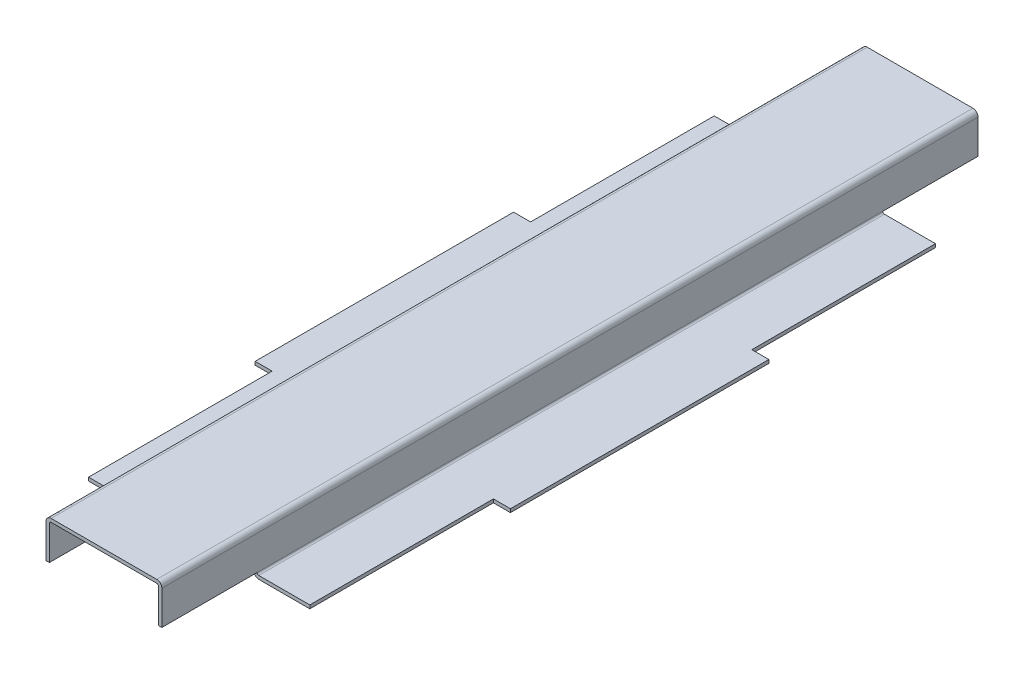
ISO-10303-21;
HEADER;
FILE_DESCRIPTION(('STEP AP214'),'2;1');
FILE_NAME('part.step','',(''),(''),'','','');
FILE_SCHEMA(('AUTOMOTIVE_DESIGN { 1 0 10303 214 1 1 1 1 }'));
ENDSEC;
DATA;
#1=APPLICATION_CONTEXT('core data for automotive mechanical design processes');
#2=APPLICATION_PROTOCOL_DEFINITION('international standard','automotive_design',2000,#1);
#3=PRODUCT_CONTEXT('',#1,'mechanical');
#4=PRODUCT('Part','Part','',(#3));
#5=PRODUCT_RELATED_PRODUCT_CATEGORY('part','',(#4));
#6=PRODUCT_DEFINITION_FORMATION('','',#4);
#7=PRODUCT_DEFINITION_CONTEXT('part definition',#1,'design');
#8=PRODUCT_DEFINITION('design','',#6,#7);
#9=PRODUCT_DEFINITION_SHAPE('','',#8);
#10=(LENGTH_UNIT() NAMED_UNIT(*) SI_UNIT(.MILLI.,.METRE.));
#11=(NAMED_UNIT(*) PLANE_ANGLE_UNIT() SI_UNIT($,.RADIAN.));
#12=(NAMED_UNIT(*) SI_UNIT($,.STERADIAN.) SOLID_ANGLE_UNIT());
#13=UNCERTAINTY_MEASURE_WITH_UNIT(LENGTH_MEASURE(1.E-05),#10,'distance_accuracy_value','');
#14=(GEOMETRIC_REPRESENTATION_CONTEXT(3) GLOBAL_UNCERTAINTY_ASSIGNED_CONTEXT((#13)) GLOBAL_UNIT_ASSIGNED_CONTEXT((#10,
#11,#12)) REPRESENTATION_CONTEXT('',''));
#15=CARTESIAN_POINT('',(0.,0.,0.));
#16=DIRECTION('',(0.,0.,1.));
#17=DIRECTION('',(1.,0.,0.));
#18=AXIS2_PLACEMENT_3D('',#15,#16,#17);
#19=CARTESIAN_POINT('',(-206.6,-79.375,584.2));
#20=DIRECTION('',(-1.,0.,0.));
#21=DIRECTION('',(0.,0.,1.));
#22=AXIS2_PLACEMENT_3D('',#19,#20,#21);
#23=PLANE('',#22);
#24=DIRECTION('',(0.,0.,-1.));
#25=VECTOR('',#24,1.);
#26=CARTESIAN_POINT('',(-206.6,-73.025,584.2));
#27=LINE('',#26,#25);
#28=CARTESIAN_POINT('',(-206.6,-73.025,584.2));
#29=VERTEX_POINT('',#28);
#30=CARTESIAN_POINT('',(-206.6,-73.025,241.3));
#31=VERTEX_POINT('',#30);
#32=EDGE_CURVE('E571',#29,#31,#27,.T.);
#33=ORIENTED_EDGE('',*,*,#32,.T.);
#34=DIRECTION('',(0.,-1.,0.));
#35=VECTOR('',#34,1.);
#36=CARTESIAN_POINT('',(-206.6,-79.375,241.3));
#37=LINE('',#36,#35);
#38=CARTESIAN_POINT('',(-206.6,-79.375,241.3));
#39=VERTEX_POINT('',#38);
#40=EDGE_CURVE('E252',#31,#39,#37,.T.);
#41=ORIENTED_EDGE('',*,*,#40,.T.);
#42=DIRECTION('',(0.,0.,-1.));
#43=VECTOR('',#42,1.);
#44=CARTESIAN_POINT('',(-206.6,-79.375,584.2));
#45=LINE('',#44,#43);
#46=CARTESIAN_POINT('',(-206.6,-79.375,584.2));
#47=VERTEX_POINT('',#46);
#48=EDGE_CURVE('E566',#47,#39,#45,.T.);
#49=ORIENTED_EDGE('',*,*,#48,.F.);
#50=DIRECTION('',(0.,1.,0.));
#51=VECTOR('',#50,1.);
#52=CARTESIAN_POINT('',(-206.6,-79.375,584.2));
#53=LINE('',#52,#51);
#54=EDGE_CURVE('E488',#47,#29,#53,.T.);
#55=ORIENTED_EDGE('',*,*,#54,.T.);
#56=EDGE_LOOP('',(#33,#41,#49,#55));
#57=FACE_BOUND('',#56,.T.);
#58=ADVANCED_FACE('F36',(#57),#23,.T.);
#59=CARTESIAN_POINT('',(-206.6,-79.3749999999999,-241.3));
#60=VERTEX_POINT('',#59);
#61=CARTESIAN_POINT('',(-206.6,-79.375,-584.2));
#62=VERTEX_POINT('',#61);
#63=EDGE_CURVE('E565',#60,#62,#45,.T.);
#64=ORIENTED_EDGE('',*,*,#63,.F.);
#65=DIRECTION('',(0.,1.,0.));
#66=VECTOR('',#65,1.);
#67=CARTESIAN_POINT('',(-206.6,-79.3749999999999,-241.3));
#68=LINE('',#67,#66);
#69=CARTESIAN_POINT('',(-206.6,-73.025,-241.3));
#70=VERTEX_POINT('',#69);
#71=EDGE_CURVE('E267',#60,#70,#68,.T.);
#72=ORIENTED_EDGE('',*,*,#71,.T.);
#73=CARTESIAN_POINT('',(-206.6,-73.025,-584.2));
#74=VERTEX_POINT('',#73);
#75=EDGE_CURVE('E570',#70,#74,#27,.T.);
#76=ORIENTED_EDGE('',*,*,#75,.T.);
#77=DIRECTION('',(0.,1.,0.));
#78=VECTOR('',#77,1.);
#79=CARTESIAN_POINT('',(-206.6,-79.375,-584.2));
#80=LINE('',#79,#78);
#81=EDGE_CURVE('E525',#62,#74,#80,.T.);
#82=ORIENTED_EDGE('',*,*,#81,.F.);
#83=EDGE_LOOP('',(#64,#72,#76,#82));
#84=FACE_BOUND('',#83,.T.);
#85=ADVANCED_FACE('F684',(#84),#23,.T.);
#86=CARTESIAN_POINT('',(111.35,-69.85,-584.2));
#87=DIRECTION('',(0.,0.,1.));
#88=DIRECTION('',(1.,0.,0.));
#89=AXIS2_PLACEMENT_3D('',#86,#87,#88);
#90=PLANE('',#89);
#91=CARTESIAN_POINT('',(-111.35,-69.85,-584.2));
#92=DIRECTION('',(0.,0.,1.));
#93=DIRECTION('',(1.,0.,0.));
#94=AXIS2_PLACEMENT_3D('',#91,#92,#93);
#95=CIRCLE('',#94,3.17499999999999);
#96=CARTESIAN_POINT('',(-111.35,-73.025,-584.2));
#97=VERTEX_POINT('',#96);
#98=CARTESIAN_POINT('',(-108.175,-69.85,-584.2));
#99=VERTEX_POINT('',#98);
#100=EDGE_CURVE('E518',#97,#99,#95,.T.);
#101=ORIENTED_EDGE('',*,*,#100,.T.);
#102=DIRECTION('',(1.,0.,0.));
#103=VECTOR('',#102,1.);
#104=CARTESIAN_POINT('',(-108.175,-69.85,-584.2));
#105=LINE('',#104,#103);
#106=CARTESIAN_POINT('',(-101.825,-69.85,-584.2));
#107=VERTEX_POINT('',#106);
#108=EDGE_CURVE('E299',#99,#107,#105,.T.);
#109=ORIENTED_EDGE('',*,*,#108,.T.);
#110=CARTESIAN_POINT('',(-111.35,-69.85,-584.2));
#111=DIRECTION('',(0.,0.,1.));
#112=DIRECTION('',(1.,0.,0.));
#113=AXIS2_PLACEMENT_3D('',#110,#111,#112);
#114=CIRCLE('',#113,9.525);
#115=CARTESIAN_POINT('',(-111.35,-79.375,-584.2));
#116=VERTEX_POINT('',#115);
#117=EDGE_CURVE('E532',#116,#107,#114,.T.);
#118=ORIENTED_EDGE('',*,*,#117,.F.);
#119=DIRECTION('',(1.,0.,0.));
#120=VECTOR('',#119,1.);
#121=CARTESIAN_POINT('',(-111.35,-79.375,-584.2));
#122=LINE('',#121,#120);
#123=EDGE_CURVE('E529',#62,#116,#122,.T.);
#124=ORIENTED_EDGE('',*,*,#123,.F.);
#125=ORIENTED_EDGE('',*,*,#81,.T.);
#126=DIRECTION('',(1.,0.,0.));
#127=VECTOR('',#126,1.);
#128=CARTESIAN_POINT('',(-111.35,-73.025,-584.2));
#129=LINE('',#128,#127);
#130=EDGE_CURVE('E521',#74,#97,#129,.T.);
#131=ORIENTED_EDGE('',*,*,#130,.T.);
#132=EDGE_LOOP('',(#101,#109,#118,#124,#125,#131));
#133=FACE_BOUND('',#132,.T.);
#134=ADVANCED_FACE('F690',(#133),#90,.F.);
#135=CARTESIAN_POINT('',(206.6,-73.025,584.2));
#136=DIRECTION('',(1.,0.,0.));
#137=DIRECTION('',(0.,0.,-1.));
#138=AXIS2_PLACEMENT_3D('',#135,#136,#137);
#139=PLANE('',#138);
#140=DIRECTION('',(0.,-1.,0.));
#141=VECTOR('',#140,1.);
#142=CARTESIAN_POINT('',(206.6,-79.375,241.3));
#143=LINE('',#142,#141);
#144=CARTESIAN_POINT('',(206.6,-73.025,241.3));
#145=VERTEX_POINT('',#144);
#146=CARTESIAN_POINT('',(206.6,-79.375,241.3));
#147=VERTEX_POINT('',#146);
#148=EDGE_CURVE('E361',#145,#147,#143,.T.);
#149=ORIENTED_EDGE('',*,*,#148,.F.);
#150=DIRECTION('',(0.,0.,-1.));
#151=VECTOR('',#150,1.);
#152=CARTESIAN_POINT('',(206.6,-73.025,584.2));
#153=LINE('',#152,#151);
#154=CARTESIAN_POINT('',(206.6,-73.025,584.2));
#155=VERTEX_POINT('',#154);
#156=EDGE_CURVE('E600',#155,#145,#153,.T.);
#157=ORIENTED_EDGE('',*,*,#156,.F.);
#158=DIRECTION('',(0.,-1.,0.));
#159=VECTOR('',#158,1.);
#160=CARTESIAN_POINT('',(206.6,-73.025,584.2));
#161=LINE('',#160,#159);
#162=CARTESIAN_POINT('',(206.6,-79.375,584.2));
#163=VERTEX_POINT('',#162);
#164=EDGE_CURVE('E467',#155,#163,#161,.T.);
#165=ORIENTED_EDGE('',*,*,#164,.T.);
#166=DIRECTION('',(0.,0.,-1.));
#167=VECTOR('',#166,1.);
#168=CARTESIAN_POINT('',(206.6,-79.375,584.2));
#169=LINE('',#168,#167);
#170=EDGE_CURVE('E11',#163,#147,#169,.T.);
#171=ORIENTED_EDGE('',*,*,#170,.T.);
#172=EDGE_LOOP('',(#149,#157,#165,#171));
#173=FACE_BOUND('',#172,.T.);
#174=ADVANCED_FACE('F629',(#173),#139,.T.);
#175=CARTESIAN_POINT('',(111.35,-69.85,584.2));
#176=DIRECTION('',(0.,0.,1.));
#177=DIRECTION('',(1.,0.,0.));
#178=AXIS2_PLACEMENT_3D('',#175,#176,#177);
#179=PLANE('',#178);
#180=DIRECTION('',(1.,0.,0.));
#181=VECTOR('',#180,1.);
#182=CARTESIAN_POINT('',(101.825,-69.85,584.2));
#183=LINE('',#182,#181);
#184=CARTESIAN_POINT('',(101.825,-69.85,584.2));
#185=VERTEX_POINT('',#184);
#186=CARTESIAN_POINT('',(108.175,-69.85,584.2));
#187=VERTEX_POINT('',#186);
#188=EDGE_CURVE('E401',#185,#187,#183,.T.);
#189=ORIENTED_EDGE('',*,*,#188,.F.);
#190=CARTESIAN_POINT('',(111.35,-69.85,584.2));
#191=DIRECTION('',(0.,0.,1.));
#192=DIRECTION('',(1.,0.,0.));
#193=AXIS2_PLACEMENT_3D('',#190,#191,#192);
#194=CIRCLE('',#193,9.525);
#195=CARTESIAN_POINT('',(111.35,-79.375,584.2));
#196=VERTEX_POINT('',#195);
#197=EDGE_CURVE('E499',#185,#196,#194,.T.);
#198=ORIENTED_EDGE('',*,*,#197,.T.);
#199=DIRECTION('',(1.,0.,0.));
#200=VECTOR('',#199,1.);
#201=CARTESIAN_POINT('',(111.35,-79.375,584.2));
#202=LINE('',#201,#200);
#203=EDGE_CURVE('E464',#196,#163,#202,.T.);
#204=ORIENTED_EDGE('',*,*,#203,.T.);
#205=ORIENTED_EDGE('',*,*,#164,.F.);
#206=DIRECTION('',(1.,0.,0.));
#207=VECTOR('',#206,1.);
#208=CARTESIAN_POINT('',(111.35,-73.025,584.2));
#209=LINE('',#208,#207);
#210=CARTESIAN_POINT('',(111.35,-73.025,584.2));
#211=VERTEX_POINT('',#210);
#212=EDGE_CURVE('E472',#211,#155,#209,.T.);
#213=ORIENTED_EDGE('',*,*,#212,.F.);
#214=CARTESIAN_POINT('',(111.35,-69.85,584.2));
#215=DIRECTION('',(0.,0.,1.));
#216=DIRECTION('',(1.,0.,0.));
#217=AXIS2_PLACEMENT_3D('',#214,#215,#216);
#218=CIRCLE('',#217,3.17499999999999);
#219=EDGE_CURVE('E476',#187,#211,#218,.T.);
#220=ORIENTED_EDGE('',*,*,#219,.F.);
#221=EDGE_LOOP('',(#189,#198,#204,#205,#213,#220));
#222=FACE_BOUND('',#221,.T.);
#223=ADVANCED_FACE('F625',(#222),#179,.T.);
#224=CARTESIAN_POINT('',(111.35,-79.375,584.2));
#225=DIRECTION('',(0.,1.,0.));
#226=DIRECTION('',(0.,0.,1.));
#227=AXIS2_PLACEMENT_3D('',#224,#225,#226);
#228=PLANE('',#227);
#229=DIRECTION('',(1.,0.,0.));
#230=VECTOR('',#229,1.);
#231=CARTESIAN_POINT('',(111.35,-79.375,-584.2));
#232=LINE('',#231,#230);
#233=CARTESIAN_POINT('',(111.35,-79.375,-584.2));
#234=VERTEX_POINT('',#233);
#235=CARTESIAN_POINT('',(206.6,-79.375,-584.2));
#236=VERTEX_POINT('',#235);
#237=EDGE_CURVE('E463',#234,#236,#232,.T.);
#238=ORIENTED_EDGE('',*,*,#237,.T.);
#239=CARTESIAN_POINT('',(206.6,-79.375,-241.3));
#240=VERTEX_POINT('',#239);
#241=EDGE_CURVE('E45',#240,#236,#169,.T.);
#242=ORIENTED_EDGE('',*,*,#241,.F.);
#243=DIRECTION('',(-1.,0.,0.));
#244=VECTOR('',#243,1.);
#245=CARTESIAN_POINT('',(238.35,-79.3749999999999,-241.3));
#246=LINE('',#245,#244);
#247=CARTESIAN_POINT('',(238.35,-79.3749999999999,-241.3));
#248=VERTEX_POINT('',#247);
#249=EDGE_CURVE('E387',#248,#240,#246,.T.);
#250=ORIENTED_EDGE('',*,*,#249,.F.);
#251=DIRECTION('',(0.,0.,-1.));
#252=VECTOR('',#251,1.);
#253=CARTESIAN_POINT('',(238.35,-79.375,241.3));
#254=LINE('',#253,#252);
#255=CARTESIAN_POINT('',(238.35,-79.375,241.3));
#256=VERTEX_POINT('',#255);
#257=EDGE_CURVE('E366',#256,#248,#254,.T.);
#258=ORIENTED_EDGE('',*,*,#257,.F.);
#259=DIRECTION('',(-1.,0.,0.));
#260=VECTOR('',#259,1.);
#261=CARTESIAN_POINT('',(238.35,-79.375,241.3));
#262=LINE('',#261,#260);
#263=EDGE_CURVE('E391',#256,#147,#262,.T.);
#264=ORIENTED_EDGE('',*,*,#263,.T.);
#265=ORIENTED_EDGE('',*,*,#170,.F.);
#266=ORIENTED_EDGE('',*,*,#203,.F.);
#267=DIRECTION('',(0.,0.,-1.));
#268=VECTOR('',#267,1.);
#269=CARTESIAN_POINT('',(111.35,-79.375,584.2));
#270=LINE('',#269,#268);
#271=EDGE_CURVE('E502',#196,#234,#270,.T.);
#272=ORIENTED_EDGE('',*,*,#271,.T.);
#273=EDGE_LOOP('',(#238,#242,#250,#258,#264,#265,#266,#272));
#274=FACE_BOUND('',#273,.T.);
#275=ADVANCED_FACE('F38',(#274),#228,.F.);
#276=DIRECTION('',(0.,1.,0.));
#277=VECTOR('',#276,1.);
#278=CARTESIAN_POINT('',(206.6,-79.3749999999999,-241.3));
#279=LINE('',#278,#277);
#280=CARTESIAN_POINT('',(206.6,-73.0249999999999,-241.3));
#281=VERTEX_POINT('',#280);
#282=EDGE_CURVE('E60',#240,#281,#279,.T.);
#283=ORIENTED_EDGE('',*,*,#282,.F.);
#284=ORIENTED_EDGE('',*,*,#241,.T.);
#285=DIRECTION('',(0.,-1.,0.));
#286=VECTOR('',#285,1.);
#287=CARTESIAN_POINT('',(206.6,-73.025,-584.2));
#288=LINE('',#287,#286);
#289=CARTESIAN_POINT('',(206.6,-73.025,-584.2));
#290=VERTEX_POINT('',#289);
#291=EDGE_CURVE('E506',#290,#236,#288,.T.);
#292=ORIENTED_EDGE('',*,*,#291,.F.);
#293=EDGE_CURVE('E599',#281,#290,#153,.T.);
#294=ORIENTED_EDGE('',*,*,#293,.F.);
#295=EDGE_LOOP('',(#283,#284,#292,#294));
#296=FACE_BOUND('',#295,.T.);
#297=ADVANCED_FACE('F612',(#296),#139,.T.);
#298=CARTESIAN_POINT('',(111.35,-73.025,584.2));
#299=DIRECTION('',(0.,1.,0.));
#300=DIRECTION('',(0.,0.,1.));
#301=AXIS2_PLACEMENT_3D('',#298,#299,#300);
#302=PLANE('',#301);
#303=DIRECTION('',(1.,0.,0.));
#304=VECTOR('',#303,1.);
#305=CARTESIAN_POINT('',(111.35,-73.025,-584.2));
#306=LINE('',#305,#304);
#307=CARTESIAN_POINT('',(111.35,-73.025,-584.2));
#308=VERTEX_POINT('',#307);
#309=EDGE_CURVE('E510',#308,#290,#306,.T.);
#310=ORIENTED_EDGE('',*,*,#309,.F.);
#311=DIRECTION('',(0.,0.,-1.));
#312=VECTOR('',#311,1.);
#313=CARTESIAN_POINT('',(111.35,-73.025,584.2));
#314=LINE('',#313,#312);
#315=EDGE_CURVE('E597',#211,#308,#314,.T.);
#316=ORIENTED_EDGE('',*,*,#315,.F.);
#317=ORIENTED_EDGE('',*,*,#212,.T.);
#318=ORIENTED_EDGE('',*,*,#156,.T.);
#319=DIRECTION('',(-1.,0.,0.));
#320=VECTOR('',#319,1.);
#321=CARTESIAN_POINT('',(238.35,-73.025,241.3));
#322=LINE('',#321,#320);
#323=CARTESIAN_POINT('',(238.35,-73.025,241.3));
#324=VERTEX_POINT('',#323);
#325=EDGE_CURVE('E374',#324,#145,#322,.T.);
#326=ORIENTED_EDGE('',*,*,#325,.F.);
#327=DIRECTION('',(0.,0.,1.));
#328=VECTOR('',#327,1.);
#329=CARTESIAN_POINT('',(238.35,-73.025,241.3));
#330=LINE('',#329,#328);
#331=CARTESIAN_POINT('',(238.35,-73.0249999999999,-241.3));
#332=VERTEX_POINT('',#331);
#333=EDGE_CURVE('E372',#332,#324,#330,.T.);
#334=ORIENTED_EDGE('',*,*,#333,.F.);
#335=DIRECTION('',(-1.,0.,0.));
#336=VECTOR('',#335,1.);
#337=CARTESIAN_POINT('',(238.35,-73.0249999999999,-241.3));
#338=LINE('',#337,#336);
#339=EDGE_CURVE('E383',#332,#281,#338,.T.);
#340=ORIENTED_EDGE('',*,*,#339,.T.);
#341=ORIENTED_EDGE('',*,*,#293,.T.);
#342=EDGE_LOOP('',(#310,#316,#317,#318,#326,#334,#340,#341));
#343=FACE_BOUND('',#342,.T.);
#344=ADVANCED_FACE('F609',(#343),#302,.T.);
#345=CARTESIAN_POINT('',(111.35,-69.85,584.2));
#346=DIRECTION('',(0.,0.,-1.));
#347=DIRECTION('',(-1.,0.,0.));
#348=AXIS2_PLACEMENT_3D('',#345,#346,#347);
#349=CYLINDRICAL_SURFACE('',#348,3.17499999999999);
#350=CARTESIAN_POINT('',(111.35,-69.85,-584.2));
#351=DIRECTION('',(0.,0.,1.));
#352=DIRECTION('',(1.,0.,0.));
#353=AXIS2_PLACEMENT_3D('',#350,#351,#352);
#354=CIRCLE('',#353,3.17499999999999);
#355=CARTESIAN_POINT('',(108.175,-69.85,-584.2));
#356=VERTEX_POINT('',#355);
#357=EDGE_CURVE('E514',#356,#308,#354,.T.);
#358=ORIENTED_EDGE('',*,*,#357,.F.);
#359=DIRECTION('',(0.,0.,-1.));
#360=VECTOR('',#359,1.);
#361=CARTESIAN_POINT('',(108.175,-69.85,584.2));
#362=LINE('',#361,#360);
#363=EDGE_CURVE('E593',#187,#356,#362,.T.);
#364=ORIENTED_EDGE('',*,*,#363,.F.);
#365=ORIENTED_EDGE('',*,*,#219,.T.);
#366=ORIENTED_EDGE('',*,*,#315,.T.);
#367=EDGE_LOOP('',(#358,#364,#365,#366));
#368=FACE_BOUND('',#367,.T.);
#369=ADVANCED_FACE('F620',(#368),#349,.F.);
#370=CARTESIAN_POINT('',(108.175,-6.35,584.2));
#371=DIRECTION('',(1.,0.,0.));
#372=DIRECTION('',(0.,1.,0.));
#373=AXIS2_PLACEMENT_3D('',#370,#371,#372);
#374=PLANE('',#373);
#375=ORIENTED_EDGE('',*,*,#363,.T.);
#376=DIRECTION('',(0.,0.,1.));
#377=VECTOR('',#376,1.);
#378=CARTESIAN_POINT('',(108.175,-69.85,-762.));
#379=LINE('',#378,#377);
#380=CARTESIAN_POINT('',(108.175,-69.85,-762.));
#381=VERTEX_POINT('',#380);
#382=EDGE_CURVE('E358',#381,#356,#379,.T.);
#383=ORIENTED_EDGE('',*,*,#382,.F.);
#384=DIRECTION('',(0.,1.,0.));
#385=VECTOR('',#384,1.);
#386=CARTESIAN_POINT('',(108.175,-69.85,-762.));
#387=LINE('',#386,#385);
#388=CARTESIAN_POINT('',(108.175,-6.35,-762.));
#389=VERTEX_POINT('',#388);
#390=EDGE_CURVE('E294',#381,#389,#387,.T.);
#391=ORIENTED_EDGE('',*,*,#390,.T.);
#392=DIRECTION('',(0.,0.,-1.));
#393=VECTOR('',#392,1.);
#394=CARTESIAN_POINT('',(108.175,-6.35,584.2));
#395=LINE('',#394,#393);
#396=CARTESIAN_POINT('',(108.175,-6.35,762.));
#397=VERTEX_POINT('',#396);
#398=EDGE_CURVE('E590',#397,#389,#395,.T.);
#399=ORIENTED_EDGE('',*,*,#398,.F.);
#400=DIRECTION('',(0.,1.,0.));
#401=VECTOR('',#400,1.);
#402=CARTESIAN_POINT('',(108.175,-69.85,762.));
#403=LINE('',#402,#401);
#404=CARTESIAN_POINT('',(108.175,-69.85,762.));
#405=VERTEX_POINT('',#404);
#406=EDGE_CURVE('E396',#405,#397,#403,.T.);
#407=ORIENTED_EDGE('',*,*,#406,.F.);
#408=DIRECTION('',(0.,0.,-1.));
#409=VECTOR('',#408,1.);
#410=CARTESIAN_POINT('',(108.175,-69.85,762.));
#411=LINE('',#410,#409);
#412=EDGE_CURVE('E441',#405,#187,#411,.T.);
#413=ORIENTED_EDGE('',*,*,#412,.T.);
#414=EDGE_LOOP('',(#375,#383,#391,#399,#407,#413));
#415=FACE_BOUND('',#414,.T.);
#416=ADVANCED_FACE('F657',(#415),#374,.T.);
#417=CARTESIAN_POINT('',(98.65,-6.35,584.2));
#418=DIRECTION('',(0.,0.,-1.));
#419=DIRECTION('',(-1.,0.,0.));
#420=AXIS2_PLACEMENT_3D('',#417,#418,#419);
#421=CYLINDRICAL_SURFACE('',#420,9.525);
#422=ORIENTED_EDGE('',*,*,#398,.T.);
#423=CARTESIAN_POINT('',(98.65,-6.35,-762.));
#424=DIRECTION('',(0.,0.,1.));
#425=DIRECTION('',(1.,0.,0.));
#426=AXIS2_PLACEMENT_3D('',#423,#424,#425);
#427=CIRCLE('',#426,9.52499999999999);
#428=CARTESIAN_POINT('',(98.65,3.175,-762.));
#429=VERTEX_POINT('',#428);
#430=EDGE_CURVE('E339',#389,#429,#427,.T.);
#431=ORIENTED_EDGE('',*,*,#430,.T.);
#432=DIRECTION('',(0.,0.,-1.));
#433=VECTOR('',#432,1.);
#434=CARTESIAN_POINT('',(98.65,3.175,584.2));
#435=LINE('',#434,#433);
#436=CARTESIAN_POINT('',(98.65,3.175,762.));
#437=VERTEX_POINT('',#436);
#438=EDGE_CURVE('E587',#437,#429,#435,.T.);
#439=ORIENTED_EDGE('',*,*,#438,.F.);
#440=CARTESIAN_POINT('',(98.65,-6.35,762.));
#441=DIRECTION('',(0.,0.,1.));
#442=DIRECTION('',(1.,0.,0.));
#443=AXIS2_PLACEMENT_3D('',#440,#441,#442);
#444=CIRCLE('',#443,9.52499999999999);
#445=EDGE_CURVE('E400',#397,#437,#444,.T.);
#446=ORIENTED_EDGE('',*,*,#445,.F.);
#447=EDGE_LOOP('',(#422,#431,#439,#446));
#448=FACE_BOUND('',#447,.T.);
#449=ADVANCED_FACE('F664',(#448),#421,.T.);
#450=CARTESIAN_POINT('',(-98.65,3.175,584.2));
#451=DIRECTION('',(0.,1.,0.));
#452=DIRECTION('',(0.,0.,1.));
#453=AXIS2_PLACEMENT_3D('',#450,#451,#452);
#454=PLANE('',#453);
#455=ORIENTED_EDGE('',*,*,#438,.T.);
#456=DIRECTION('',(-1.,0.,0.));
#457=VECTOR('',#456,1.);
#458=CARTESIAN_POINT('',(98.65,3.175,-762.));
#459=LINE('',#458,#457);
#460=CARTESIAN_POINT('',(-98.65,3.175,-762.));
#461=VERTEX_POINT('',#460);
#462=EDGE_CURVE('E335',#429,#461,#459,.T.);
#463=ORIENTED_EDGE('',*,*,#462,.T.);
#464=DIRECTION('',(0.,0.,-1.));
#465=VECTOR('',#464,1.);
#466=CARTESIAN_POINT('',(-98.65,3.175,584.2));
#467=LINE('',#466,#465);
#468=CARTESIAN_POINT('',(-98.65,3.175,762.));
#469=VERTEX_POINT('',#468);
#470=EDGE_CURVE('E584',#469,#461,#467,.T.);
#471=ORIENTED_EDGE('',*,*,#470,.F.);
#472=DIRECTION('',(-1.,0.,0.));
#473=VECTOR('',#472,1.);
#474=CARTESIAN_POINT('',(98.65,3.175,762.));
#475=LINE('',#474,#473);
#476=EDGE_CURVE('E405',#437,#469,#475,.T.);
#477=ORIENTED_EDGE('',*,*,#476,.F.);
#478=EDGE_LOOP('',(#455,#463,#471,#477));
#479=FACE_BOUND('',#478,.T.);
#480=ADVANCED_FACE('F709',(#479),#454,.T.);
#481=CARTESIAN_POINT('',(-98.65,-6.35,584.2));
#482=DIRECTION('',(0.,0.,-1.));
#483=DIRECTION('',(-1.,0.,0.));
#484=AXIS2_PLACEMENT_3D('',#481,#482,#483);
#485=CYLINDRICAL_SURFACE('',#484,9.525);
#486=ORIENTED_EDGE('',*,*,#470,.T.);
#487=CARTESIAN_POINT('',(-98.65,-6.35,-762.));
#488=DIRECTION('',(0.,0.,1.));
#489=DIRECTION('',(1.,0.,0.));
#490=AXIS2_PLACEMENT_3D('',#487,#488,#489);
#491=CIRCLE('',#490,9.525);
#492=CARTESIAN_POINT('',(-108.175,-6.35,-762.));
#493=VERTEX_POINT('',#492);
#494=EDGE_CURVE('E331',#461,#493,#491,.T.);
#495=ORIENTED_EDGE('',*,*,#494,.T.);
#496=DIRECTION('',(0.,0.,-1.));
#497=VECTOR('',#496,1.);
#498=CARTESIAN_POINT('',(-108.175,-6.35,584.2));
#499=LINE('',#498,#497);
#500=CARTESIAN_POINT('',(-108.175,-6.35,762.));
#501=VERTEX_POINT('',#500);
#502=EDGE_CURVE('E581',#501,#493,#499,.T.);
#503=ORIENTED_EDGE('',*,*,#502,.F.);
#504=CARTESIAN_POINT('',(-98.65,-6.35,762.));
#505=DIRECTION('',(0.,0.,1.));
#506=DIRECTION('',(1.,0.,0.));
#507=AXIS2_PLACEMENT_3D('',#504,#505,#506);
#508=CIRCLE('',#507,9.525);
#509=EDGE_CURVE('E409',#469,#501,#508,.T.);
#510=ORIENTED_EDGE('',*,*,#509,.F.);
#511=EDGE_LOOP('',(#486,#495,#503,#510));
#512=FACE_BOUND('',#511,.T.);
#513=ADVANCED_FACE('F705',(#512),#485,.T.);
#514=CARTESIAN_POINT('',(-108.175,-6.35,584.2));
#515=DIRECTION('',(-1.,0.,0.));
#516=DIRECTION('',(0.,-1.,0.));
#517=AXIS2_PLACEMENT_3D('',#514,#515,#516);
#518=PLANE('',#517);
#519=ORIENTED_EDGE('',*,*,#502,.T.);
#520=DIRECTION('',(0.,-1.,0.));
#521=VECTOR('',#520,1.);
#522=CARTESIAN_POINT('',(-108.175,-6.35,-762.));
#523=LINE('',#522,#521);
#524=CARTESIAN_POINT('',(-108.175,-69.85,-762.));
#525=VERTEX_POINT('',#524);
#526=EDGE_CURVE('E327',#493,#525,#523,.T.);
#527=ORIENTED_EDGE('',*,*,#526,.T.);
#528=DIRECTION('',(0.,0.,1.));
#529=VECTOR('',#528,1.);
#530=CARTESIAN_POINT('',(-108.175,-69.85,-762.));
#531=LINE('',#530,#529);
#532=EDGE_CURVE('E343',#525,#99,#531,.T.);
#533=ORIENTED_EDGE('',*,*,#532,.T.);
#534=DIRECTION('',(0.,0.,-1.));
#535=VECTOR('',#534,1.);
#536=CARTESIAN_POINT('',(-108.175,-69.85,584.2));
#537=LINE('',#536,#535);
#538=CARTESIAN_POINT('',(-108.175,-69.85,584.2));
#539=VERTEX_POINT('',#538);
#540=EDGE_CURVE('E577',#539,#99,#537,.T.);
#541=ORIENTED_EDGE('',*,*,#540,.F.);
#542=DIRECTION('',(0.,0.,-1.));
#543=VECTOR('',#542,1.);
#544=CARTESIAN_POINT('',(-108.175,-69.85,762.));
#545=LINE('',#544,#543);
#546=CARTESIAN_POINT('',(-108.175,-69.85,762.));
#547=VERTEX_POINT('',#546);
#548=EDGE_CURVE('E459',#547,#539,#545,.T.);
#549=ORIENTED_EDGE('',*,*,#548,.F.);
#550=DIRECTION('',(0.,-1.,0.));
#551=VECTOR('',#550,1.);
#552=CARTESIAN_POINT('',(-108.175,-6.35,762.));
#553=LINE('',#552,#551);
#554=EDGE_CURVE('E413',#501,#547,#553,.T.);
#555=ORIENTED_EDGE('',*,*,#554,.F.);
#556=EDGE_LOOP('',(#519,#527,#533,#541,#549,#555));
#557=FACE_BOUND('',#556,.T.);
#558=ADVANCED_FACE('F701',(#557),#518,.T.);
#559=CARTESIAN_POINT('',(-111.35,-69.85,584.2));
#560=DIRECTION('',(0.,0.,-1.));
#561=DIRECTION('',(-1.,0.,0.));
#562=AXIS2_PLACEMENT_3D('',#559,#560,#561);
#563=CYLINDRICAL_SURFACE('',#562,3.17499999999999);
#564=ORIENTED_EDGE('',*,*,#100,.F.);
#565=DIRECTION('',(0.,0.,-1.));
#566=VECTOR('',#565,1.);
#567=CARTESIAN_POINT('',(-111.35,-73.025,584.2));
#568=LINE('',#567,#566);
#569=CARTESIAN_POINT('',(-111.35,-73.025,584.2));
#570=VERTEX_POINT('',#569);
#571=EDGE_CURVE('E574',#570,#97,#568,.T.);
#572=ORIENTED_EDGE('',*,*,#571,.F.);
#573=CARTESIAN_POINT('',(-111.35,-69.85,584.2));
#574=DIRECTION('',(0.,0.,1.));
#575=DIRECTION('',(1.,0.,0.));
#576=AXIS2_PLACEMENT_3D('',#573,#574,#575);
#577=CIRCLE('',#576,3.17499999999999);
#578=EDGE_CURVE('E480',#570,#539,#577,.T.);
#579=ORIENTED_EDGE('',*,*,#578,.T.);
#580=ORIENTED_EDGE('',*,*,#540,.T.);
#581=EDGE_LOOP('',(#564,#572,#579,#580));
#582=FACE_BOUND('',#581,.T.);
#583=ADVANCED_FACE('F698',(#582),#563,.F.);
#584=CARTESIAN_POINT('',(-111.35,-73.025,584.2));
#585=DIRECTION('',(0.,1.,0.));
#586=DIRECTION('',(0.,0.,1.));
#587=AXIS2_PLACEMENT_3D('',#584,#585,#586);
#588=PLANE('',#587);
#589=ORIENTED_EDGE('',*,*,#130,.F.);
#590=ORIENTED_EDGE('',*,*,#75,.F.);
#591=DIRECTION('',(1.,0.,0.));
#592=VECTOR('',#591,1.);
#593=CARTESIAN_POINT('',(-238.35,-73.0249999999999,-241.3));
#594=LINE('',#593,#592);
#595=CARTESIAN_POINT('',(-238.35,-73.0249999999999,-241.3));
#596=VERTEX_POINT('',#595);
#597=EDGE_CURVE('E52',#596,#70,#594,.T.);
#598=ORIENTED_EDGE('',*,*,#597,.F.);
#599=DIRECTION('',(0.,0.,1.));
#600=VECTOR('',#599,1.);
#601=CARTESIAN_POINT('',(-238.35,-73.025,241.3));
#602=LINE('',#601,#600);
#603=CARTESIAN_POINT('',(-238.35,-73.025,241.3));
#604=VERTEX_POINT('',#603);
#605=EDGE_CURVE('E263',#596,#604,#602,.T.);
#606=ORIENTED_EDGE('',*,*,#605,.T.);
#607=DIRECTION('',(1.,0.,0.));
#608=VECTOR('',#607,1.);
#609=CARTESIAN_POINT('',(-238.35,-73.025,241.3));
#610=LINE('',#609,#608);
#611=EDGE_CURVE('E246',#604,#31,#610,.T.);
#612=ORIENTED_EDGE('',*,*,#611,.T.);
#613=ORIENTED_EDGE('',*,*,#32,.F.);
#614=DIRECTION('',(1.,0.,0.));
#615=VECTOR('',#614,1.);
#616=CARTESIAN_POINT('',(-111.35,-73.025,584.2));
#617=LINE('',#616,#615);
#618=EDGE_CURVE('E484',#29,#570,#617,.T.);
#619=ORIENTED_EDGE('',*,*,#618,.T.);
#620=ORIENTED_EDGE('',*,*,#571,.T.);
#621=EDGE_LOOP('',(#589,#590,#598,#606,#612,#613,#619,#620));
#622=FACE_BOUND('',#621,.T.);
#623=ADVANCED_FACE('F270',(#622),#588,.T.);
#624=CARTESIAN_POINT('',(-111.35,-79.375,584.2));
#625=DIRECTION('',(0.,1.,0.));
#626=DIRECTION('',(0.,0.,1.));
#627=AXIS2_PLACEMENT_3D('',#624,#625,#626);
#628=PLANE('',#627);
#629=ORIENTED_EDGE('',*,*,#123,.T.);
#630=DIRECTION('',(0.,0.,-1.));
#631=VECTOR('',#630,1.);
#632=CARTESIAN_POINT('',(-111.35,-79.375,584.2));
#633=LINE('',#632,#631);
#634=CARTESIAN_POINT('',(-111.35,-79.375,584.2));
#635=VERTEX_POINT('',#634);
#636=EDGE_CURVE('E561',#635,#116,#633,.T.);
#637=ORIENTED_EDGE('',*,*,#636,.F.);
#638=DIRECTION('',(1.,0.,0.));
#639=VECTOR('',#638,1.);
#640=CARTESIAN_POINT('',(-111.35,-79.375,584.2));
#641=LINE('',#640,#639);
#642=EDGE_CURVE('E492',#47,#635,#641,.T.);
#643=ORIENTED_EDGE('',*,*,#642,.F.);
#644=ORIENTED_EDGE('',*,*,#48,.T.);
#645=DIRECTION('',(1.,0.,0.));
#646=VECTOR('',#645,1.);
#647=CARTESIAN_POINT('',(-238.35,-79.375,241.3));
#648=LINE('',#647,#646);
#649=CARTESIAN_POINT('',(-238.35,-79.375,241.3));
#650=VERTEX_POINT('',#649);
#651=EDGE_CURVE('E282',#650,#39,#648,.T.);
#652=ORIENTED_EDGE('',*,*,#651,.F.);
#653=DIRECTION('',(0.,0.,-1.));
#654=VECTOR('',#653,1.);
#655=CARTESIAN_POINT('',(-238.35,-79.375,241.3));
#656=LINE('',#655,#654);
#657=CARTESIAN_POINT('',(-238.35,-79.3749999999999,-241.3));
#658=VERTEX_POINT('',#657);
#659=EDGE_CURVE('E265',#650,#658,#656,.T.);
#660=ORIENTED_EDGE('',*,*,#659,.T.);
#661=DIRECTION('',(1.,0.,0.));
#662=VECTOR('',#661,1.);
#663=CARTESIAN_POINT('',(-238.35,-79.3749999999999,-241.3));
#664=LINE('',#663,#662);
#665=EDGE_CURVE('E289',#658,#60,#664,.T.);
#666=ORIENTED_EDGE('',*,*,#665,.T.);
#667=ORIENTED_EDGE('',*,*,#63,.T.);
#668=EDGE_LOOP('',(#629,#637,#643,#644,#652,#660,#666,#667));
#669=FACE_BOUND('',#668,.T.);
#670=ADVANCED_FACE('F694',(#669),#628,.F.);
#671=CARTESIAN_POINT('',(-111.35,-69.85,584.2));
#672=DIRECTION('',(0.,0.,-1.));
#673=DIRECTION('',(-1.,0.,0.));
#674=AXIS2_PLACEMENT_3D('',#671,#672,#673);
#675=CYLINDRICAL_SURFACE('',#674,9.525);
#676=ORIENTED_EDGE('',*,*,#117,.T.);
#677=DIRECTION('',(0.,0.,-1.));
#678=VECTOR('',#677,1.);
#679=CARTESIAN_POINT('',(-101.825,-69.85,584.2));
#680=LINE('',#679,#678);
#681=CARTESIAN_POINT('',(-101.825,-69.85,584.2));
#682=VERTEX_POINT('',#681);
#683=EDGE_CURVE('E557',#682,#107,#680,.T.);
#684=ORIENTED_EDGE('',*,*,#683,.F.);
#685=CARTESIAN_POINT('',(-111.35,-69.85,584.2));
#686=DIRECTION('',(0.,0.,1.));
#687=DIRECTION('',(1.,0.,0.));
#688=AXIS2_PLACEMENT_3D('',#685,#686,#687);
#689=CIRCLE('',#688,9.525);
#690=EDGE_CURVE('E495',#635,#682,#689,.T.);
#691=ORIENTED_EDGE('',*,*,#690,.F.);
#692=ORIENTED_EDGE('',*,*,#636,.T.);
#693=EDGE_LOOP('',(#676,#684,#691,#692));
#694=FACE_BOUND('',#693,.T.);
#695=ADVANCED_FACE('F767',(#694),#675,.T.);
#696=CARTESIAN_POINT('',(-101.825,-6.35,584.2));
#697=DIRECTION('',(-1.,0.,0.));
#698=DIRECTION('',(0.,-1.,0.));
#699=AXIS2_PLACEMENT_3D('',#696,#697,#698);
#700=PLANE('',#699);
#701=ORIENTED_EDGE('',*,*,#683,.T.);
#702=DIRECTION('',(0.,0.,1.));
#703=VECTOR('',#702,1.);
#704=CARTESIAN_POINT('',(-101.825,-69.85,-762.));
#705=LINE('',#704,#703);
#706=CARTESIAN_POINT('',(-101.825,-69.85,-762.));
#707=VERTEX_POINT('',#706);
#708=EDGE_CURVE('E352',#707,#107,#705,.T.);
#709=ORIENTED_EDGE('',*,*,#708,.F.);
#710=DIRECTION('',(0.,1.,0.));
#711=VECTOR('',#710,1.);
#712=CARTESIAN_POINT('',(-101.825,-69.85,-762.));
#713=LINE('',#712,#711);
#714=CARTESIAN_POINT('',(-101.825,-6.35,-762.));
#715=VERTEX_POINT('',#714);
#716=EDGE_CURVE('E319',#707,#715,#713,.T.);
#717=ORIENTED_EDGE('',*,*,#716,.T.);
#718=DIRECTION('',(0.,0.,-1.));
#719=VECTOR('',#718,1.);
#720=CARTESIAN_POINT('',(-101.825,-6.35,584.2));
#721=LINE('',#720,#719);
#722=CARTESIAN_POINT('',(-101.825,-6.35,762.));
#723=VERTEX_POINT('',#722);
#724=EDGE_CURVE('E554',#723,#715,#721,.T.);
#725=ORIENTED_EDGE('',*,*,#724,.F.);
#726=DIRECTION('',(0.,1.,0.));
#727=VECTOR('',#726,1.);
#728=CARTESIAN_POINT('',(-101.825,-69.85,762.));
#729=LINE('',#728,#727);
#730=CARTESIAN_POINT('',(-101.825,-69.85,762.));
#731=VERTEX_POINT('',#730);
#732=EDGE_CURVE('E419',#731,#723,#729,.T.);
#733=ORIENTED_EDGE('',*,*,#732,.F.);
#734=DIRECTION('',(0.,0.,-1.));
#735=VECTOR('',#734,1.);
#736=CARTESIAN_POINT('',(-101.825,-69.85,762.));
#737=LINE('',#736,#735);
#738=EDGE_CURVE('E455',#731,#682,#737,.T.);
#739=ORIENTED_EDGE('',*,*,#738,.T.);
#740=EDGE_LOOP('',(#701,#709,#717,#725,#733,#739));
#741=FACE_BOUND('',#740,.T.);
#742=ADVANCED_FACE('F770',(#741),#700,.F.);
#743=CARTESIAN_POINT('',(-98.65,-6.35,584.2));
#744=DIRECTION('',(0.,0.,-1.));
#745=DIRECTION('',(-1.,0.,0.));
#746=AXIS2_PLACEMENT_3D('',#743,#744,#745);
#747=CYLINDRICAL_SURFACE('',#746,3.175);
#748=ORIENTED_EDGE('',*,*,#724,.T.);
#749=CARTESIAN_POINT('',(-98.65,-6.35,-762.));
#750=DIRECTION('',(0.,0.,-1.));
#751=DIRECTION('',(1.,0.,0.));
#752=AXIS2_PLACEMENT_3D('',#749,#750,#751);
#753=CIRCLE('',#752,3.175);
#754=CARTESIAN_POINT('',(-98.65,-3.175,-762.));
#755=VERTEX_POINT('',#754);
#756=EDGE_CURVE('E315',#715,#755,#753,.T.);
#757=ORIENTED_EDGE('',*,*,#756,.T.);
#758=DIRECTION('',(0.,0.,-1.));
#759=VECTOR('',#758,1.);
#760=CARTESIAN_POINT('',(-98.65,-3.175,584.2));
#761=LINE('',#760,#759);
#762=CARTESIAN_POINT('',(-98.65,-3.175,762.));
#763=VERTEX_POINT('',#762);
#764=EDGE_CURVE('E551',#763,#755,#761,.T.);
#765=ORIENTED_EDGE('',*,*,#764,.F.);
#766=CARTESIAN_POINT('',(-98.65,-6.35,762.));
#767=DIRECTION('',(0.,0.,-1.));
#768=DIRECTION('',(1.,0.,0.));
#769=AXIS2_PLACEMENT_3D('',#766,#767,#768);
#770=CIRCLE('',#769,3.175);
#771=EDGE_CURVE('E423',#723,#763,#770,.T.);
#772=ORIENTED_EDGE('',*,*,#771,.F.);
#773=EDGE_LOOP('',(#748,#757,#765,#772));
#774=FACE_BOUND('',#773,.T.);
#775=ADVANCED_FACE('F772',(#774),#747,.F.);
#776=CARTESIAN_POINT('',(-98.65,-3.175,584.2));
#777=DIRECTION('',(0.,1.,0.));
#778=DIRECTION('',(0.,0.,1.));
#779=AXIS2_PLACEMENT_3D('',#776,#777,#778);
#780=PLANE('',#779);
#781=ORIENTED_EDGE('',*,*,#764,.T.);
#782=DIRECTION('',(1.,0.,0.));
#783=VECTOR('',#782,1.);
#784=CARTESIAN_POINT('',(-98.65,-3.175,-762.));
#785=LINE('',#784,#783);
#786=CARTESIAN_POINT('',(98.65,-3.175,-762.));
#787=VERTEX_POINT('',#786);
#788=EDGE_CURVE('E311',#755,#787,#785,.T.);
#789=ORIENTED_EDGE('',*,*,#788,.T.);
#790=DIRECTION('',(0.,0.,-1.));
#791=VECTOR('',#790,1.);
#792=CARTESIAN_POINT('',(98.65,-3.175,584.2));
#793=LINE('',#792,#791);
#794=CARTESIAN_POINT('',(98.65,-3.175,762.));
#795=VERTEX_POINT('',#794);
#796=EDGE_CURVE('E548',#795,#787,#793,.T.);
#797=ORIENTED_EDGE('',*,*,#796,.F.);
#798=DIRECTION('',(1.,0.,0.));
#799=VECTOR('',#798,1.);
#800=CARTESIAN_POINT('',(-98.65,-3.175,762.));
#801=LINE('',#800,#799);
#802=EDGE_CURVE('E427',#763,#795,#801,.T.);
#803=ORIENTED_EDGE('',*,*,#802,.F.);
#804=EDGE_LOOP('',(#781,#789,#797,#803));
#805=FACE_BOUND('',#804,.T.);
#806=ADVANCED_FACE('F776',(#805),#780,.F.);
#807=CARTESIAN_POINT('',(98.65,-6.35,584.2));
#808=DIRECTION('',(0.,0.,-1.));
#809=DIRECTION('',(-1.,0.,0.));
#810=AXIS2_PLACEMENT_3D('',#807,#808,#809);
#811=CYLINDRICAL_SURFACE('',#810,3.175);
#812=ORIENTED_EDGE('',*,*,#796,.T.);
#813=CARTESIAN_POINT('',(98.65,-6.35,-762.));
#814=DIRECTION('',(0.,0.,-1.));
#815=DIRECTION('',(1.,0.,0.));
#816=AXIS2_PLACEMENT_3D('',#813,#814,#815);
#817=CIRCLE('',#816,3.175);
#818=CARTESIAN_POINT('',(101.825,-6.35,-762.));
#819=VERTEX_POINT('',#818);
#820=EDGE_CURVE('E307',#787,#819,#817,.T.);
#821=ORIENTED_EDGE('',*,*,#820,.T.);
#822=DIRECTION('',(0.,0.,-1.));
#823=VECTOR('',#822,1.);
#824=CARTESIAN_POINT('',(101.825,-6.35,584.2));
#825=LINE('',#824,#823);
#826=CARTESIAN_POINT('',(101.825,-6.35,762.));
#827=VERTEX_POINT('',#826);
#828=EDGE_CURVE('E545',#827,#819,#825,.T.);
#829=ORIENTED_EDGE('',*,*,#828,.F.);
#830=CARTESIAN_POINT('',(98.65,-6.35,762.));
#831=DIRECTION('',(0.,0.,-1.));
#832=DIRECTION('',(1.,0.,0.));
#833=AXIS2_PLACEMENT_3D('',#830,#831,#832);
#834=CIRCLE('',#833,3.175);
#835=EDGE_CURVE('E431',#795,#827,#834,.T.);
#836=ORIENTED_EDGE('',*,*,#835,.F.);
#837=EDGE_LOOP('',(#812,#821,#829,#836));
#838=FACE_BOUND('',#837,.T.);
#839=ADVANCED_FACE('F780',(#838),#811,.F.);
#840=CARTESIAN_POINT('',(101.825,-6.35,584.2));
#841=DIRECTION('',(1.,0.,0.));
#842=DIRECTION('',(0.,1.,0.));
#843=AXIS2_PLACEMENT_3D('',#840,#841,#842);
#844=PLANE('',#843);
#845=ORIENTED_EDGE('',*,*,#828,.T.);
#846=DIRECTION('',(0.,-1.,0.));
#847=VECTOR('',#846,1.);
#848=CARTESIAN_POINT('',(101.825,-6.35,-762.));
#849=LINE('',#848,#847);
#850=CARTESIAN_POINT('',(101.825,-69.85,-762.));
#851=VERTEX_POINT('',#850);
#852=EDGE_CURVE('E303',#819,#851,#849,.T.);
#853=ORIENTED_EDGE('',*,*,#852,.T.);
#854=DIRECTION('',(0.,0.,1.));
#855=VECTOR('',#854,1.);
#856=CARTESIAN_POINT('',(101.825,-69.85,-762.));
#857=LINE('',#856,#855);
#858=CARTESIAN_POINT('',(101.825,-69.85,-584.2));
#859=VERTEX_POINT('',#858);
#860=EDGE_CURVE('E355',#851,#859,#857,.T.);
#861=ORIENTED_EDGE('',*,*,#860,.T.);
#862=DIRECTION('',(0.,0.,-1.));
#863=VECTOR('',#862,1.);
#864=CARTESIAN_POINT('',(101.825,-69.85,584.2));
#865=LINE('',#864,#863);
#866=EDGE_CURVE('E541',#185,#859,#865,.T.);
#867=ORIENTED_EDGE('',*,*,#866,.F.);
#868=DIRECTION('',(0.,0.,-1.));
#869=VECTOR('',#868,1.);
#870=CARTESIAN_POINT('',(101.825,-69.85,762.));
#871=LINE('',#870,#869);
#872=CARTESIAN_POINT('',(101.825,-69.85,762.));
#873=VERTEX_POINT('',#872);
#874=EDGE_CURVE('E451',#873,#185,#871,.T.);
#875=ORIENTED_EDGE('',*,*,#874,.F.);
#876=DIRECTION('',(0.,-1.,0.));
#877=VECTOR('',#876,1.);
#878=CARTESIAN_POINT('',(101.825,-6.35,762.));
#879=LINE('',#878,#877);
#880=EDGE_CURVE('E435',#827,#873,#879,.T.);
#881=ORIENTED_EDGE('',*,*,#880,.F.);
#882=EDGE_LOOP('',(#845,#853,#861,#867,#875,#881));
#883=FACE_BOUND('',#882,.T.);
#884=ADVANCED_FACE('F648',(#883),#844,.F.);
#885=CARTESIAN_POINT('',(111.35,-69.85,584.2));
#886=DIRECTION('',(0.,0.,-1.));
#887=DIRECTION('',(-1.,0.,0.));
#888=AXIS2_PLACEMENT_3D('',#885,#886,#887);
#889=CYLINDRICAL_SURFACE('',#888,9.525);
#890=CARTESIAN_POINT('',(111.35,-69.85,-584.2));
#891=DIRECTION('',(0.,0.,1.));
#892=DIRECTION('',(1.,0.,0.));
#893=AXIS2_PLACEMENT_3D('',#890,#891,#892);
#894=CIRCLE('',#893,9.525);
#895=EDGE_CURVE('E468',#859,#234,#894,.T.);
#896=ORIENTED_EDGE('',*,*,#895,.T.);
#897=ORIENTED_EDGE('',*,*,#271,.F.);
#898=ORIENTED_EDGE('',*,*,#197,.F.);
#899=ORIENTED_EDGE('',*,*,#866,.T.);
#900=EDGE_LOOP('',(#896,#897,#898,#899));
#901=FACE_BOUND('',#900,.T.);
#902=ADVANCED_FACE('F643',(#901),#889,.T.);
#903=DIRECTION('',(1.,0.,0.));
#904=VECTOR('',#903,1.);
#905=CARTESIAN_POINT('',(-108.175,-69.85,584.2));
#906=LINE('',#905,#904);
#907=EDGE_CURVE('E395',#539,#682,#906,.T.);
#908=ORIENTED_EDGE('',*,*,#907,.F.);
#909=ORIENTED_EDGE('',*,*,#578,.F.);
#910=ORIENTED_EDGE('',*,*,#618,.F.);
#911=ORIENTED_EDGE('',*,*,#54,.F.);
#912=ORIENTED_EDGE('',*,*,#642,.T.);
#913=ORIENTED_EDGE('',*,*,#690,.T.);
#914=EDGE_LOOP('',(#908,#909,#910,#911,#912,#913));
#915=FACE_BOUND('',#914,.T.);
#916=ADVANCED_FACE('F731',(#915),#179,.T.);
#917=ORIENTED_EDGE('',*,*,#895,.F.);
#918=DIRECTION('',(1.,0.,0.));
#919=VECTOR('',#918,1.);
#920=CARTESIAN_POINT('',(101.825,-69.85,-584.2));
#921=LINE('',#920,#919);
#922=EDGE_CURVE('E257',#859,#356,#921,.T.);
#923=ORIENTED_EDGE('',*,*,#922,.T.);
#924=ORIENTED_EDGE('',*,*,#357,.T.);
#925=ORIENTED_EDGE('',*,*,#309,.T.);
#926=ORIENTED_EDGE('',*,*,#291,.T.);
#927=ORIENTED_EDGE('',*,*,#237,.F.);
#928=EDGE_LOOP('',(#917,#923,#924,#925,#926,#927));
#929=FACE_BOUND('',#928,.T.);
#930=ADVANCED_FACE('F616',(#929),#90,.F.);
#931=CARTESIAN_POINT('',(-108.175,-69.85,762.));
#932=DIRECTION('',(0.,1.,0.));
#933=DIRECTION('',(-1.,0.,0.));
#934=AXIS2_PLACEMENT_3D('',#931,#932,#933);
#935=PLANE('',#934);
#936=ORIENTED_EDGE('',*,*,#907,.T.);
#937=ORIENTED_EDGE('',*,*,#738,.F.);
#938=DIRECTION('',(1.,0.,0.));
#939=VECTOR('',#938,1.);
#940=CARTESIAN_POINT('',(-108.175,-69.85,762.));
#941=LINE('',#940,#939);
#942=EDGE_CURVE('E416',#547,#731,#941,.T.);
#943=ORIENTED_EDGE('',*,*,#942,.F.);
#944=ORIENTED_EDGE('',*,*,#548,.T.);
#945=EDGE_LOOP('',(#936,#937,#943,#944));
#946=FACE_BOUND('',#945,.T.);
#947=ADVANCED_FACE('F674',(#946),#935,.F.);
#948=CARTESIAN_POINT('',(101.825,-69.85,762.));
#949=DIRECTION('',(0.,1.,0.));
#950=DIRECTION('',(0.,0.,1.));
#951=AXIS2_PLACEMENT_3D('',#948,#949,#950);
#952=PLANE('',#951);
#953=ORIENTED_EDGE('',*,*,#188,.T.);
#954=ORIENTED_EDGE('',*,*,#412,.F.);
#955=DIRECTION('',(1.,0.,0.));
#956=VECTOR('',#955,1.);
#957=CARTESIAN_POINT('',(101.825,-69.85,762.));
#958=LINE('',#957,#956);
#959=EDGE_CURVE('E438',#873,#405,#958,.T.);
#960=ORIENTED_EDGE('',*,*,#959,.F.);
#961=ORIENTED_EDGE('',*,*,#874,.T.);
#962=EDGE_LOOP('',(#953,#954,#960,#961));
#963=FACE_BOUND('',#962,.T.);
#964=ADVANCED_FACE('F672',(#963),#952,.F.);
#965=CARTESIAN_POINT('',(98.65,-6.35,762.));
#966=DIRECTION('',(0.,0.,1.));
#967=DIRECTION('',(1.,0.,0.));
#968=AXIS2_PLACEMENT_3D('',#965,#966,#967);
#969=PLANE('',#968);
#970=ORIENTED_EDGE('',*,*,#406,.T.);
#971=ORIENTED_EDGE('',*,*,#445,.T.);
#972=ORIENTED_EDGE('',*,*,#476,.T.);
#973=ORIENTED_EDGE('',*,*,#509,.T.);
#974=ORIENTED_EDGE('',*,*,#554,.T.);
#975=ORIENTED_EDGE('',*,*,#942,.T.);
#976=ORIENTED_EDGE('',*,*,#732,.T.);
#977=ORIENTED_EDGE('',*,*,#771,.T.);
#978=ORIENTED_EDGE('',*,*,#802,.T.);
#979=ORIENTED_EDGE('',*,*,#835,.T.);
#980=ORIENTED_EDGE('',*,*,#880,.T.);
#981=ORIENTED_EDGE('',*,*,#959,.T.);
#982=EDGE_LOOP('',(#970,#971,#972,#973,#974,#975,#976,#977,#978,#979,#980,#981));
#983=FACE_BOUND('',#982,.T.);
#984=ADVANCED_FACE('F669',(#983),#969,.T.);
#985=CARTESIAN_POINT('',(238.35,-79.375,241.3));
#986=DIRECTION('',(0.,0.,-1.));
#987=DIRECTION('',(-1.,0.,0.));
#988=AXIS2_PLACEMENT_3D('',#985,#986,#987);
#989=PLANE('',#988);
#990=ORIENTED_EDGE('',*,*,#148,.T.);
#991=ORIENTED_EDGE('',*,*,#263,.F.);
#992=DIRECTION('',(0.,-1.,0.));
#993=VECTOR('',#992,1.);
#994=CARTESIAN_POINT('',(238.35,-79.375,241.3));
#995=LINE('',#994,#993);
#996=EDGE_CURVE('E362',#324,#256,#995,.T.);
#997=ORIENTED_EDGE('',*,*,#996,.F.);
#998=ORIENTED_EDGE('',*,*,#325,.T.);
#999=EDGE_LOOP('',(#990,#991,#997,#998));
#1000=FACE_BOUND('',#999,.T.);
#1001=ADVANCED_FACE('F632',(#1000),#989,.F.);
#1002=CARTESIAN_POINT('',(238.35,-79.3749999999999,-241.3));
#1003=DIRECTION('',(0.,0.,1.));
#1004=DIRECTION('',(1.,0.,0.));
#1005=AXIS2_PLACEMENT_3D('',#1002,#1003,#1004);
#1006=PLANE('',#1005);
#1007=ORIENTED_EDGE('',*,*,#282,.T.);
#1008=ORIENTED_EDGE('',*,*,#339,.F.);
#1009=DIRECTION('',(0.,1.,0.));
#1010=VECTOR('',#1009,1.);
#1011=CARTESIAN_POINT('',(238.35,-79.3749999999999,-241.3));
#1012=LINE('',#1011,#1010);
#1013=EDGE_CURVE('E369',#248,#332,#1012,.T.);
#1014=ORIENTED_EDGE('',*,*,#1013,.F.);
#1015=ORIENTED_EDGE('',*,*,#249,.T.);
#1016=EDGE_LOOP('',(#1007,#1008,#1014,#1015));
#1017=FACE_BOUND('',#1016,.T.);
#1018=ADVANCED_FACE('F639',(#1017),#1006,.F.);
#1019=CARTESIAN_POINT('',(238.35,0.,0.));
#1020=DIRECTION('',(-1.,0.,0.));
#1021=DIRECTION('',(0.,0.,1.));
#1022=AXIS2_PLACEMENT_3D('',#1019,#1020,#1021);
#1023=PLANE('',#1022);
#1024=ORIENTED_EDGE('',*,*,#996,.T.);
#1025=ORIENTED_EDGE('',*,*,#257,.T.);
#1026=ORIENTED_EDGE('',*,*,#1013,.T.);
#1027=ORIENTED_EDGE('',*,*,#333,.T.);
#1028=EDGE_LOOP('',(#1024,#1025,#1026,#1027));
#1029=FACE_BOUND('',#1028,.T.);
#1030=ADVANCED_FACE('F635',(#1029),#1023,.F.);
#1031=CARTESIAN_POINT('',(101.825,-69.85,-762.));
#1032=DIRECTION('',(0.,-1.,0.));
#1033=DIRECTION('',(0.,0.,-1.));
#1034=AXIS2_PLACEMENT_3D('',#1031,#1032,#1033);
#1035=PLANE('',#1034);
#1036=ORIENTED_EDGE('',*,*,#922,.F.);
#1037=ORIENTED_EDGE('',*,*,#860,.F.);
#1038=DIRECTION('',(1.,0.,0.));
#1039=VECTOR('',#1038,1.);
#1040=CARTESIAN_POINT('',(101.825,-69.85,-762.));
#1041=LINE('',#1040,#1039);
#1042=EDGE_CURVE('E298',#851,#381,#1041,.T.);
#1043=ORIENTED_EDGE('',*,*,#1042,.T.);
#1044=ORIENTED_EDGE('',*,*,#382,.T.);
#1045=EDGE_LOOP('',(#1036,#1037,#1043,#1044));
#1046=FACE_BOUND('',#1045,.T.);
#1047=ADVANCED_FACE('F654',(#1046),#1035,.T.);
#1048=CARTESIAN_POINT('',(-108.175,-69.85,-762.));
#1049=DIRECTION('',(0.,-1.,0.));
#1050=DIRECTION('',(1.,0.,0.));
#1051=AXIS2_PLACEMENT_3D('',#1048,#1049,#1050);
#1052=PLANE('',#1051);
#1053=ORIENTED_EDGE('',*,*,#108,.F.);
#1054=ORIENTED_EDGE('',*,*,#532,.F.);
#1055=DIRECTION('',(1.,0.,0.));
#1056=VECTOR('',#1055,1.);
#1057=CARTESIAN_POINT('',(-108.175,-69.85,-762.));
#1058=LINE('',#1057,#1056);
#1059=EDGE_CURVE('E323',#525,#707,#1058,.T.);
#1060=ORIENTED_EDGE('',*,*,#1059,.T.);
#1061=ORIENTED_EDGE('',*,*,#708,.T.);
#1062=EDGE_LOOP('',(#1053,#1054,#1060,#1061));
#1063=FACE_BOUND('',#1062,.T.);
#1064=ADVANCED_FACE('F763',(#1063),#1052,.T.);
#1065=CARTESIAN_POINT('',(98.65,-6.35,-762.));
#1066=DIRECTION('',(0.,0.,-1.));
#1067=DIRECTION('',(1.,0.,0.));
#1068=AXIS2_PLACEMENT_3D('',#1065,#1066,#1067);
#1069=PLANE('',#1068);
#1070=ORIENTED_EDGE('',*,*,#390,.F.);
#1071=ORIENTED_EDGE('',*,*,#1042,.F.);
#1072=ORIENTED_EDGE('',*,*,#852,.F.);
#1073=ORIENTED_EDGE('',*,*,#820,.F.);
#1074=ORIENTED_EDGE('',*,*,#788,.F.);
#1075=ORIENTED_EDGE('',*,*,#756,.F.);
#1076=ORIENTED_EDGE('',*,*,#716,.F.);
#1077=ORIENTED_EDGE('',*,*,#1059,.F.);
#1078=ORIENTED_EDGE('',*,*,#526,.F.);
#1079=ORIENTED_EDGE('',*,*,#494,.F.);
#1080=ORIENTED_EDGE('',*,*,#462,.F.);
#1081=ORIENTED_EDGE('',*,*,#430,.F.);
#1082=EDGE_LOOP('',(#1070,#1071,#1072,#1073,#1074,#1075,#1076,#1077,#1078,#1079,#1080,#1081));
#1083=FACE_BOUND('',#1082,.T.);
#1084=ADVANCED_FACE('F660',(#1083),#1069,.T.);
#1085=CARTESIAN_POINT('',(-238.35,-79.375,241.3));
#1086=DIRECTION('',(0.,0.,1.));
#1087=DIRECTION('',(1.,0.,0.));
#1088=AXIS2_PLACEMENT_3D('',#1085,#1086,#1087);
#1089=PLANE('',#1088);
#1090=ORIENTED_EDGE('',*,*,#40,.F.);
#1091=ORIENTED_EDGE('',*,*,#611,.F.);
#1092=DIRECTION('',(0.,-1.,0.));
#1093=VECTOR('',#1092,1.);
#1094=CARTESIAN_POINT('',(-238.35,-79.375,241.3));
#1095=LINE('',#1094,#1093);
#1096=EDGE_CURVE('E249',#604,#650,#1095,.T.);
#1097=ORIENTED_EDGE('',*,*,#1096,.T.);
#1098=ORIENTED_EDGE('',*,*,#651,.T.);
#1099=EDGE_LOOP('',(#1090,#1091,#1097,#1098));
#1100=FACE_BOUND('',#1099,.T.);
#1101=ADVANCED_FACE('F248',(#1100),#1089,.T.);
#1102=CARTESIAN_POINT('',(-238.35,-79.3749999999999,-241.3));
#1103=DIRECTION('',(0.,0.,-1.));
#1104=DIRECTION('',(-1.,0.,0.));
#1105=AXIS2_PLACEMENT_3D('',#1102,#1103,#1104);
#1106=PLANE('',#1105);
#1107=ORIENTED_EDGE('',*,*,#71,.F.);
#1108=ORIENTED_EDGE('',*,*,#665,.F.);
#1109=DIRECTION('',(0.,1.,0.));
#1110=VECTOR('',#1109,1.);
#1111=CARTESIAN_POINT('',(-238.35,-79.3749999999999,-241.3));
#1112=LINE('',#1111,#1110);
#1113=EDGE_CURVE('E273',#658,#596,#1112,.T.);
#1114=ORIENTED_EDGE('',*,*,#1113,.T.);
#1115=ORIENTED_EDGE('',*,*,#597,.T.);
#1116=EDGE_LOOP('',(#1107,#1108,#1114,#1115));
#1117=FACE_BOUND('',#1116,.T.);
#1118=ADVANCED_FACE('F805',(#1117),#1106,.T.);
#1119=CARTESIAN_POINT('',(-238.35,0.,0.));
#1120=DIRECTION('',(1.,0.,0.));
#1121=DIRECTION('',(0.,0.,1.));
#1122=AXIS2_PLACEMENT_3D('',#1119,#1120,#1121);
#1123=PLANE('',#1122);
#1124=ORIENTED_EDGE('',*,*,#1096,.F.);
#1125=ORIENTED_EDGE('',*,*,#605,.F.);
#1126=ORIENTED_EDGE('',*,*,#1113,.F.);
#1127=ORIENTED_EDGE('',*,*,#659,.F.);
#1128=EDGE_LOOP('',(#1124,#1125,#1126,#1127));
#1129=FACE_BOUND('',#1128,.T.);
#1130=ADVANCED_FACE('F261',(#1129),#1123,.F.);
#1131=CLOSED_SHELL('',(#58,#85,#134,#174,#223,#275,#297,#344,#369,#416,#449,#480,#513,#558,#583,
#623,#670,#695,#742,#775,#806,#839,#884,#902,#916,#930,#947,#964,#984,#1001,#1018,#1030,#1047,
#1064,#1084,#1101,#1118,#1130));
#1132=MANIFOLD_SOLID_BREP('B2',#1131);
#1133=ADVANCED_BREP_SHAPE_REPRESENTATION('',(#18,#1132),#14);
#1134=SHAPE_DEFINITION_REPRESENTATION(#9,#1133);
ENDSEC;
END-ISO-10303-21;
